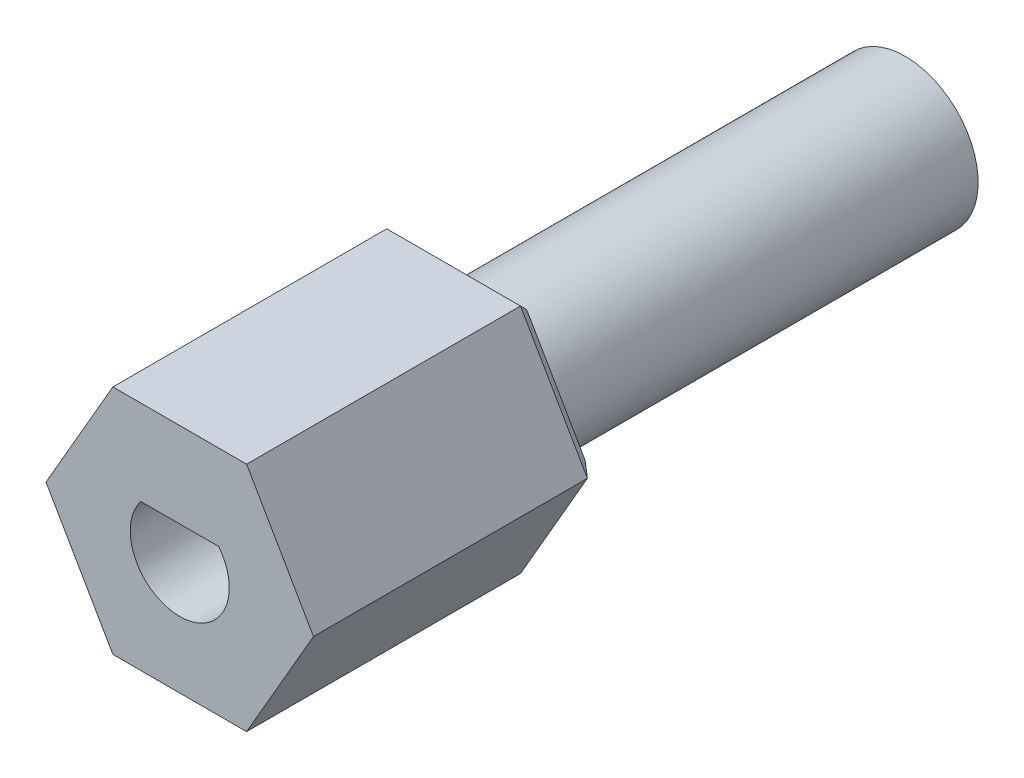
ISO-10303-21;
HEADER;
FILE_DESCRIPTION(('STEP AP214'),'2;1');
FILE_NAME('part.step','',(''),(''),'','','');
FILE_SCHEMA(('AUTOMOTIVE_DESIGN { 1 0 10303 214 1 1 1 1 }'));
ENDSEC;
DATA;
#1=APPLICATION_CONTEXT('core data for automotive mechanical design processes');
#2=APPLICATION_PROTOCOL_DEFINITION('international standard','automotive_design',2000,#1);
#3=PRODUCT_CONTEXT('',#1,'mechanical');
#4=PRODUCT('Part','Part','',(#3));
#5=PRODUCT_RELATED_PRODUCT_CATEGORY('part','',(#4));
#6=PRODUCT_DEFINITION_FORMATION('','',#4);
#7=PRODUCT_DEFINITION_CONTEXT('part definition',#1,'design');
#8=PRODUCT_DEFINITION('design','',#6,#7);
#9=PRODUCT_DEFINITION_SHAPE('','',#8);
#10=(LENGTH_UNIT() NAMED_UNIT(*) SI_UNIT(.MILLI.,.METRE.));
#11=(NAMED_UNIT(*) PLANE_ANGLE_UNIT() SI_UNIT($,.RADIAN.));
#12=(NAMED_UNIT(*) SI_UNIT($,.STERADIAN.) SOLID_ANGLE_UNIT());
#13=UNCERTAINTY_MEASURE_WITH_UNIT(LENGTH_MEASURE(1.E-05),#10,'distance_accuracy_value','');
#14=(GEOMETRIC_REPRESENTATION_CONTEXT(3) GLOBAL_UNCERTAINTY_ASSIGNED_CONTEXT((#13)) GLOBAL_UNIT_ASSIGNED_CONTEXT((#10,
#11,#12)) REPRESENTATION_CONTEXT('',''));
#15=CARTESIAN_POINT('',(0.,0.,0.));
#16=DIRECTION('',(0.,0.,1.));
#17=DIRECTION('',(1.,0.,0.));
#18=AXIS2_PLACEMENT_3D('',#15,#16,#17);
#19=CARTESIAN_POINT('',(2.29496732002876,-3.975,9.9));
#20=DIRECTION('',(-0.866025403784439,0.499999999999999,0.));
#21=DIRECTION('',(-0.499999999999999,-0.866025403784439,0.));
#22=AXIS2_PLACEMENT_3D('',#19,#20,#21);
#23=PLANE('',#22);
#24=DIRECTION('',(0.,0.,-1.));
#25=VECTOR('',#24,1.);
#26=CARTESIAN_POINT('',(2.29496732002876,-3.975,9.9));
#27=LINE('',#26,#25);
#28=CARTESIAN_POINT('',(2.29496732002876,-3.975,9.9));
#29=VERTEX_POINT('',#28);
#30=CARTESIAN_POINT('',(2.29496732002876,-3.975,0.500000000000007));
#31=VERTEX_POINT('',#30);
#32=EDGE_CURVE('E186',#29,#31,#27,.T.);
#33=ORIENTED_EDGE('',*,*,#32,.T.);
#34=DIRECTION('',(0.499999999999999,0.866025403784439,0.));
#35=VECTOR('',#34,1.);
#36=CARTESIAN_POINT('',(2.29496732002876,-3.975,0.500000000000004));
#37=LINE('',#36,#35);
#38=CARTESIAN_POINT('',(4.58993464005752,0.,0.500000000000007));
#39=VERTEX_POINT('',#38);
#40=EDGE_CURVE('E64',#31,#39,#37,.T.);
#41=ORIENTED_EDGE('',*,*,#40,.T.);
#42=DIRECTION('',(0.,0.,-1.));
#43=VECTOR('',#42,1.);
#44=CARTESIAN_POINT('',(4.58993464005752,0.,9.9));
#45=LINE('',#44,#43);
#46=CARTESIAN_POINT('',(4.58993464005752,0.,9.9));
#47=VERTEX_POINT('',#46);
#48=EDGE_CURVE('E204',#47,#39,#45,.T.);
#49=ORIENTED_EDGE('',*,*,#48,.F.);
#50=DIRECTION('',(0.499999999999999,0.866025403784439,0.));
#51=VECTOR('',#50,1.);
#52=CARTESIAN_POINT('',(2.29496732002876,-3.975,9.9));
#53=LINE('',#52,#51);
#54=EDGE_CURVE('E166',#29,#47,#53,.T.);
#55=ORIENTED_EDGE('',*,*,#54,.F.);
#56=EDGE_LOOP('',(#33,#41,#49,#55));
#57=FACE_BOUND('',#56,.T.);
#58=ADVANCED_FACE('F47',(#57),#23,.F.);
#59=CARTESIAN_POINT('',(4.58993464005752,0.,9.9));
#60=DIRECTION('',(-0.866025403784439,-0.5,0.));
#61=DIRECTION('',(0.5,-0.866025403784439,0.));
#62=AXIS2_PLACEMENT_3D('',#59,#60,#61);
#63=PLANE('',#62);
#64=ORIENTED_EDGE('',*,*,#48,.T.);
#65=DIRECTION('',(-0.5,0.866025403784439,0.));
#66=VECTOR('',#65,1.);
#67=CARTESIAN_POINT('',(4.58993464005752,0.,0.500000000000004));
#68=LINE('',#67,#66);
#69=CARTESIAN_POINT('',(2.29496732002876,3.975,0.500000000000007));
#70=VERTEX_POINT('',#69);
#71=EDGE_CURVE('E71',#39,#70,#68,.T.);
#72=ORIENTED_EDGE('',*,*,#71,.T.);
#73=DIRECTION('',(0.,0.,-1.));
#74=VECTOR('',#73,1.);
#75=CARTESIAN_POINT('',(2.29496732002876,3.975,9.9));
#76=LINE('',#75,#74);
#77=CARTESIAN_POINT('',(2.29496732002876,3.975,9.9));
#78=VERTEX_POINT('',#77);
#79=EDGE_CURVE('E201',#78,#70,#76,.T.);
#80=ORIENTED_EDGE('',*,*,#79,.F.);
#81=DIRECTION('',(-0.5,0.866025403784439,0.));
#82=VECTOR('',#81,1.);
#83=CARTESIAN_POINT('',(4.58993464005752,0.,9.9));
#84=LINE('',#83,#82);
#85=EDGE_CURVE('E171',#47,#78,#84,.T.);
#86=ORIENTED_EDGE('',*,*,#85,.F.);
#87=EDGE_LOOP('',(#64,#72,#80,#86));
#88=FACE_BOUND('',#87,.T.);
#89=ADVANCED_FACE('F285',(#88),#63,.F.);
#90=CARTESIAN_POINT('',(2.29496732002876,3.975,9.9));
#91=DIRECTION('',(0.,-1.,0.));
#92=DIRECTION('',(1.,0.,0.));
#93=AXIS2_PLACEMENT_3D('',#90,#91,#92);
#94=PLANE('',#93);
#95=ORIENTED_EDGE('',*,*,#79,.T.);
#96=DIRECTION('',(-1.,0.,0.));
#97=VECTOR('',#96,1.);
#98=CARTESIAN_POINT('',(2.29496732002876,3.975,0.500000000000004));
#99=LINE('',#98,#97);
#100=CARTESIAN_POINT('',(-2.29496732002876,3.975,0.500000000000007));
#101=VERTEX_POINT('',#100);
#102=EDGE_CURVE('E237',#70,#101,#99,.T.);
#103=ORIENTED_EDGE('',*,*,#102,.T.);
#104=DIRECTION('',(0.,0.,-1.));
#105=VECTOR('',#104,1.);
#106=CARTESIAN_POINT('',(-2.29496732002876,3.975,9.9));
#107=LINE('',#106,#105);
#108=CARTESIAN_POINT('',(-2.29496732002876,3.975,9.9));
#109=VERTEX_POINT('',#108);
#110=EDGE_CURVE('E197',#109,#101,#107,.T.);
#111=ORIENTED_EDGE('',*,*,#110,.F.);
#112=DIRECTION('',(-1.,0.,0.));
#113=VECTOR('',#112,1.);
#114=CARTESIAN_POINT('',(2.29496732002876,3.975,9.9));
#115=LINE('',#114,#113);
#116=EDGE_CURVE('E174',#78,#109,#115,.T.);
#117=ORIENTED_EDGE('',*,*,#116,.F.);
#118=EDGE_LOOP('',(#95,#103,#111,#117));
#119=FACE_BOUND('',#118,.T.);
#120=ADVANCED_FACE('F291',(#119),#94,.F.);
#121=CARTESIAN_POINT('',(-2.29496732002876,3.975,9.9));
#122=DIRECTION('',(0.866025403784439,-0.499999999999999,0.));
#123=DIRECTION('',(0.499999999999999,0.866025403784439,0.));
#124=AXIS2_PLACEMENT_3D('',#121,#122,#123);
#125=PLANE('',#124);
#126=ORIENTED_EDGE('',*,*,#110,.T.);
#127=DIRECTION('',(-0.499999999999999,-0.866025403784439,0.));
#128=VECTOR('',#127,1.);
#129=CARTESIAN_POINT('',(-2.29496732002876,3.975,0.500000000000004));
#130=LINE('',#129,#128);
#131=CARTESIAN_POINT('',(-4.58993464005752,0.,0.500000000000007));
#132=VERTEX_POINT('',#131);
#133=EDGE_CURVE('E234',#101,#132,#130,.T.);
#134=ORIENTED_EDGE('',*,*,#133,.T.);
#135=DIRECTION('',(0.,0.,-1.));
#136=VECTOR('',#135,1.);
#137=CARTESIAN_POINT('',(-4.58993464005752,0.,9.9));
#138=LINE('',#137,#136);
#139=CARTESIAN_POINT('',(-4.58993464005752,0.,9.9));
#140=VERTEX_POINT('',#139);
#141=EDGE_CURVE('E193',#140,#132,#138,.T.);
#142=ORIENTED_EDGE('',*,*,#141,.F.);
#143=DIRECTION('',(-0.5,-0.866025403784439,0.));
#144=VECTOR('',#143,1.);
#145=CARTESIAN_POINT('',(-2.29496732002876,3.975,9.9));
#146=LINE('',#145,#144);
#147=EDGE_CURVE('E177',#109,#140,#146,.T.);
#148=ORIENTED_EDGE('',*,*,#147,.F.);
#149=EDGE_LOOP('',(#126,#134,#142,#148));
#150=FACE_BOUND('',#149,.T.);
#151=ADVANCED_FACE('F370',(#150),#125,.F.);
#152=CARTESIAN_POINT('',(-4.58993464005752,0.,9.9));
#153=DIRECTION('',(0.866025403784439,0.5,0.));
#154=DIRECTION('',(-0.5,0.866025403784439,0.));
#155=AXIS2_PLACEMENT_3D('',#152,#153,#154);
#156=PLANE('',#155);
#157=ORIENTED_EDGE('',*,*,#141,.T.);
#158=DIRECTION('',(0.5,-0.866025403784439,0.));
#159=VECTOR('',#158,1.);
#160=CARTESIAN_POINT('',(-4.58993464005752,0.,0.500000000000004));
#161=LINE('',#160,#159);
#162=CARTESIAN_POINT('',(-2.29496732002876,-3.975,0.500000000000007));
#163=VERTEX_POINT('',#162);
#164=EDGE_CURVE('E231',#132,#163,#161,.T.);
#165=ORIENTED_EDGE('',*,*,#164,.T.);
#166=DIRECTION('',(0.,0.,-1.));
#167=VECTOR('',#166,1.);
#168=CARTESIAN_POINT('',(-2.29496732002876,-3.975,9.9));
#169=LINE('',#168,#167);
#170=CARTESIAN_POINT('',(-2.29496732002876,-3.975,9.9));
#171=VERTEX_POINT('',#170);
#172=EDGE_CURVE('E189',#171,#163,#169,.T.);
#173=ORIENTED_EDGE('',*,*,#172,.F.);
#174=DIRECTION('',(0.5,-0.866025403784439,0.));
#175=VECTOR('',#174,1.);
#176=CARTESIAN_POINT('',(-4.58993464005752,0.,9.9));
#177=LINE('',#176,#175);
#178=EDGE_CURVE('E180',#140,#171,#177,.T.);
#179=ORIENTED_EDGE('',*,*,#178,.F.);
#180=EDGE_LOOP('',(#157,#165,#173,#179));
#181=FACE_BOUND('',#180,.T.);
#182=ADVANCED_FACE('F356',(#181),#156,.F.);
#183=CARTESIAN_POINT('',(-2.29496732002876,-3.975,9.9));
#184=DIRECTION('',(0.,1.,0.));
#185=DIRECTION('',(-1.,0.,0.));
#186=AXIS2_PLACEMENT_3D('',#183,#184,#185);
#187=PLANE('',#186);
#188=ORIENTED_EDGE('',*,*,#172,.T.);
#189=DIRECTION('',(1.,0.,0.));
#190=VECTOR('',#189,1.);
#191=CARTESIAN_POINT('',(-2.29496732002876,-3.975,0.500000000000004));
#192=LINE('',#191,#190);
#193=EDGE_CURVE('E208',#163,#31,#192,.T.);
#194=ORIENTED_EDGE('',*,*,#193,.T.);
#195=ORIENTED_EDGE('',*,*,#32,.F.);
#196=DIRECTION('',(1.,0.,0.));
#197=VECTOR('',#196,1.);
#198=CARTESIAN_POINT('',(-2.29496732002876,-3.975,9.9));
#199=LINE('',#198,#197);
#200=EDGE_CURVE('E183',#171,#29,#199,.T.);
#201=ORIENTED_EDGE('',*,*,#200,.F.);
#202=EDGE_LOOP('',(#188,#194,#195,#201));
#203=FACE_BOUND('',#202,.T.);
#204=ADVANCED_FACE('F361',(#203),#187,.F.);
#205=CARTESIAN_POINT('',(0.,0.,9.9));
#206=DIRECTION('',(0.,0.,1.));
#207=DIRECTION('',(1.,0.,0.));
#208=AXIS2_PLACEMENT_3D('',#205,#206,#207);
#209=PLANE('',#208);
#210=CARTESIAN_POINT('',(0.,0.,9.9));
#211=DIRECTION('',(0.,0.,1.));
#212=DIRECTION('',(1.,0.,0.));
#213=AXIS2_PLACEMENT_3D('',#210,#211,#212);
#214=CIRCLE('',#213,1.7);
#215=CARTESIAN_POINT('',(-1.33697419571209,1.05,9.9));
#216=VERTEX_POINT('',#215);
#217=CARTESIAN_POINT('',(1.33697419571209,1.05,9.9));
#218=VERTEX_POINT('',#217);
#219=EDGE_CURVE('E141',#216,#218,#214,.T.);
#220=ORIENTED_EDGE('',*,*,#219,.F.);
#221=DIRECTION('',(-1.,0.,0.));
#222=VECTOR('',#221,1.);
#223=CARTESIAN_POINT('',(-1.33697419571209,1.05,9.9));
#224=LINE('',#223,#222);
#225=EDGE_CURVE('E153',#218,#216,#224,.T.);
#226=ORIENTED_EDGE('',*,*,#225,.F.);
#227=EDGE_LOOP('',(#220,#226));
#228=FACE_BOUND('',#227,.T.);
#229=ORIENTED_EDGE('',*,*,#54,.T.);
#230=ORIENTED_EDGE('',*,*,#85,.T.);
#231=ORIENTED_EDGE('',*,*,#116,.T.);
#232=ORIENTED_EDGE('',*,*,#147,.T.);
#233=ORIENTED_EDGE('',*,*,#178,.T.);
#234=ORIENTED_EDGE('',*,*,#200,.T.);
#235=EDGE_LOOP('',(#229,#230,#231,#232,#233,#234));
#236=FACE_BOUND('',#235,.T.);
#237=ADVANCED_FACE('F365',(#228,#236),#209,.T.);
#238=CARTESIAN_POINT('',(0.,0.,0.));
#239=DIRECTION('',(0.,0.,1.));
#240=DIRECTION('',(1.,0.,0.));
#241=AXIS2_PLACEMENT_3D('',#238,#239,#240);
#242=PLANE('',#241);
#243=DIRECTION('',(-0.499999999999999,-0.866025403784439,0.));
#244=VECTOR('',#243,1.);
#245=CARTESIAN_POINT('',(3.00943827815092,-1.73749999999999,0.));
#246=LINE('',#245,#244);
#247=CARTESIAN_POINT('',(4.01258437086789,0.,0.));
#248=VERTEX_POINT('',#247);
#249=CARTESIAN_POINT('',(2.00629218543395,-3.47499999999999,0.));
#250=VERTEX_POINT('',#249);
#251=EDGE_CURVE('E212',#248,#250,#246,.T.);
#252=ORIENTED_EDGE('',*,*,#251,.T.);
#253=DIRECTION('',(-1.,0.,0.));
#254=VECTOR('',#253,1.);
#255=CARTESIAN_POINT('',(0.,-3.475,0.));
#256=LINE('',#255,#254);
#257=CARTESIAN_POINT('',(-2.00629218543395,-3.475,0.));
#258=VERTEX_POINT('',#257);
#259=EDGE_CURVE('E227',#250,#258,#256,.T.);
#260=ORIENTED_EDGE('',*,*,#259,.T.);
#261=DIRECTION('',(-0.5,0.866025403784439,0.));
#262=VECTOR('',#261,1.);
#263=CARTESIAN_POINT('',(-3.00943827815092,-1.7375,0.));
#264=LINE('',#263,#262);
#265=CARTESIAN_POINT('',(-4.01258437086789,0.,0.));
#266=VERTEX_POINT('',#265);
#267=EDGE_CURVE('E224',#258,#266,#264,.T.);
#268=ORIENTED_EDGE('',*,*,#267,.T.);
#269=DIRECTION('',(0.499999999999999,0.866025403784439,0.));
#270=VECTOR('',#269,1.);
#271=CARTESIAN_POINT('',(-3.00943827815092,1.73749999999999,0.));
#272=LINE('',#271,#270);
#273=CARTESIAN_POINT('',(-2.00629218543395,3.47499999999999,0.));
#274=VERTEX_POINT('',#273);
#275=EDGE_CURVE('E221',#266,#274,#272,.T.);
#276=ORIENTED_EDGE('',*,*,#275,.T.);
#277=DIRECTION('',(1.,0.,0.));
#278=VECTOR('',#277,1.);
#279=CARTESIAN_POINT('',(0.,3.47499999999999,0.));
#280=LINE('',#279,#278);
#281=CARTESIAN_POINT('',(2.00629218543395,3.47499999999999,0.));
#282=VERTEX_POINT('',#281);
#283=EDGE_CURVE('E218',#274,#282,#280,.T.);
#284=ORIENTED_EDGE('',*,*,#283,.T.);
#285=DIRECTION('',(0.5,-0.866025403784439,0.));
#286=VECTOR('',#285,1.);
#287=CARTESIAN_POINT('',(3.00943827815092,1.7375,0.));
#288=LINE('',#287,#286);
#289=EDGE_CURVE('E215',#282,#248,#288,.T.);
#290=ORIENTED_EDGE('',*,*,#289,.T.);
#291=EDGE_LOOP('',(#252,#260,#268,#276,#284,#290));
#292=FACE_BOUND('',#291,.T.);
#293=CARTESIAN_POINT('',(0.,0.,0.));
#294=DIRECTION('',(0.,0.,-1.));
#295=DIRECTION('',(-1.,0.,0.));
#296=AXIS2_PLACEMENT_3D('',#293,#294,#295);
#297=CIRCLE('',#296,2.5);
#298=CARTESIAN_POINT('',(-2.5,0.,0.));
#299=VERTEX_POINT('',#298);
#300=EDGE_CURVE('E207',#299,#299,#297,.T.);
#301=ORIENTED_EDGE('',*,*,#300,.F.);
#302=EDGE_LOOP('',(#301));
#303=FACE_BOUND('',#302,.T.);
#304=ADVANCED_FACE('F344',(#292,#303),#242,.F.);
#305=CARTESIAN_POINT('',(0.,0.,1.9));
#306=DIRECTION('',(0.,0.,1.));
#307=DIRECTION('',(1.,0.,0.));
#308=AXIS2_PLACEMENT_3D('',#305,#306,#307);
#309=CYLINDRICAL_SURFACE('',#308,1.7);
#310=ORIENTED_EDGE('',*,*,#219,.T.);
#311=DIRECTION('',(0.,0.,1.));
#312=VECTOR('',#311,1.);
#313=CARTESIAN_POINT('',(1.33697419571209,1.05,1.9));
#314=LINE('',#313,#312);
#315=CARTESIAN_POINT('',(1.33697419571209,1.05,1.9));
#316=VERTEX_POINT('',#315);
#317=EDGE_CURVE('E135',#316,#218,#314,.T.);
#318=ORIENTED_EDGE('',*,*,#317,.F.);
#319=CARTESIAN_POINT('',(0.,0.,1.9));
#320=DIRECTION('',(0.,0.,1.));
#321=DIRECTION('',(1.,0.,0.));
#322=AXIS2_PLACEMENT_3D('',#319,#320,#321);
#323=CIRCLE('',#322,1.7);
#324=CARTESIAN_POINT('',(-1.33697419571209,1.05,1.9));
#325=VERTEX_POINT('',#324);
#326=EDGE_CURVE('E138',#325,#316,#323,.T.);
#327=ORIENTED_EDGE('',*,*,#326,.F.);
#328=DIRECTION('',(0.,0.,1.));
#329=VECTOR('',#328,1.);
#330=CARTESIAN_POINT('',(-1.33697419571209,1.05,1.9));
#331=LINE('',#330,#329);
#332=EDGE_CURVE('E147',#325,#216,#331,.T.);
#333=ORIENTED_EDGE('',*,*,#332,.T.);
#334=EDGE_LOOP('',(#310,#318,#327,#333));
#335=FACE_BOUND('',#334,.T.);
#336=ADVANCED_FACE('F137',(#335),#309,.F.);
#337=CARTESIAN_POINT('',(-1.33697419571209,1.05,1.9));
#338=DIRECTION('',(0.,1.,0.));
#339=DIRECTION('',(-1.,0.,0.));
#340=AXIS2_PLACEMENT_3D('',#337,#338,#339);
#341=PLANE('',#340);
#342=ORIENTED_EDGE('',*,*,#225,.T.);
#343=ORIENTED_EDGE('',*,*,#332,.F.);
#344=DIRECTION('',(-1.,0.,0.));
#345=VECTOR('',#344,1.);
#346=CARTESIAN_POINT('',(-1.33697419571209,1.05,1.9));
#347=LINE('',#346,#345);
#348=EDGE_CURVE('E148',#316,#325,#347,.T.);
#349=ORIENTED_EDGE('',*,*,#348,.F.);
#350=ORIENTED_EDGE('',*,*,#317,.T.);
#351=EDGE_LOOP('',(#342,#343,#349,#350));
#352=FACE_BOUND('',#351,.T.);
#353=ADVANCED_FACE('F155',(#352),#341,.F.);
#354=CARTESIAN_POINT('',(0.,0.,1.9));
#355=DIRECTION('',(0.,0.,1.));
#356=DIRECTION('',(1.,0.,0.));
#357=AXIS2_PLACEMENT_3D('',#354,#355,#356);
#358=PLANE('',#357);
#359=ORIENTED_EDGE('',*,*,#326,.T.);
#360=ORIENTED_EDGE('',*,*,#348,.T.);
#361=EDGE_LOOP('',(#359,#360));
#362=FACE_BOUND('',#361,.T.);
#363=ADVANCED_FACE('F151',(#362),#358,.T.);
#364=CARTESIAN_POINT('',(0.,0.,-15.));
#365=DIRECTION('',(0.,0.,1.));
#366=DIRECTION('',(1.,0.,0.));
#367=AXIS2_PLACEMENT_3D('',#364,#365,#366);
#368=CYLINDRICAL_SURFACE('',#367,2.5);
#369=CARTESIAN_POINT('',(0.,0.,-15.));
#370=DIRECTION('',(0.,0.,-1.));
#371=DIRECTION('',(-1.,0.,0.));
#372=AXIS2_PLACEMENT_3D('',#369,#370,#371);
#373=CIRCLE('',#372,2.5);
#374=CARTESIAN_POINT('',(-2.5,0.,-15.));
#375=VERTEX_POINT('',#374);
#376=EDGE_CURVE('E162',#375,#375,#373,.T.);
#377=ORIENTED_EDGE('',*,*,#376,.F.);
#378=EDGE_LOOP('',(#377));
#379=FACE_BOUND('',#378,.T.);
#380=ORIENTED_EDGE('',*,*,#300,.T.);
#381=EDGE_LOOP('',(#380));
#382=FACE_BOUND('',#381,.T.);
#383=ADVANCED_FACE('F393',(#379,#382),#368,.T.);
#384=CARTESIAN_POINT('',(0.,0.,-15.));
#385=DIRECTION('',(0.,0.,-1.));
#386=DIRECTION('',(-1.,0.,0.));
#387=AXIS2_PLACEMENT_3D('',#384,#385,#386);
#388=PLANE('',#387);
#389=CARTESIAN_POINT('',(0.,0.,-15.));
#390=DIRECTION('',(0.,0.,-1.));
#391=DIRECTION('',(-1.,0.,0.));
#392=AXIS2_PLACEMENT_3D('',#389,#390,#391);
#393=CIRCLE('',#392,1.95);
#394=CARTESIAN_POINT('',(-1.95,0.,-15.));
#395=VERTEX_POINT('',#394);
#396=EDGE_CURVE('E11',#395,#395,#393,.F.);
#397=ORIENTED_EDGE('',*,*,#396,.T.);
#398=EDGE_LOOP('',(#397));
#399=FACE_BOUND('',#398,.T.);
#400=ORIENTED_EDGE('',*,*,#376,.T.);
#401=EDGE_LOOP('',(#400));
#402=FACE_BOUND('',#401,.T.);
#403=ADVANCED_FACE('F396',(#399,#402),#388,.T.);
#404=CARTESIAN_POINT('',(0.,0.,-0.999999999999999));
#405=DIRECTION('',(0.,0.,-1.));
#406=DIRECTION('',(-1.,0.,0.));
#407=AXIS2_PLACEMENT_3D('',#404,#405,#406);
#408=CYLINDRICAL_SURFACE('',#407,1.45);
#409=CARTESIAN_POINT('',(0.,0.,-14.5));
#410=DIRECTION('',(0.,0.,-1.));
#411=DIRECTION('',(-1.,0.,0.));
#412=AXIS2_PLACEMENT_3D('',#409,#410,#411);
#413=CIRCLE('',#412,1.45);
#414=CARTESIAN_POINT('',(-1.45,0.,-14.5));
#415=VERTEX_POINT('',#414);
#416=EDGE_CURVE('E57',#415,#415,#413,.T.);
#417=ORIENTED_EDGE('',*,*,#416,.T.);
#418=EDGE_LOOP('',(#417));
#419=FACE_BOUND('',#418,.T.);
#420=CARTESIAN_POINT('',(0.,0.,-0.999999999999999));
#421=DIRECTION('',(0.,0.,-1.));
#422=DIRECTION('',(-1.,0.,0.));
#423=AXIS2_PLACEMENT_3D('',#420,#421,#422);
#424=CIRCLE('',#423,1.45);
#425=CARTESIAN_POINT('',(-1.45,0.,-0.999999999999999));
#426=VERTEX_POINT('',#425);
#427=EDGE_CURVE('E265',#426,#426,#424,.T.);
#428=ORIENTED_EDGE('',*,*,#427,.F.);
#429=EDGE_LOOP('',(#428));
#430=FACE_BOUND('',#429,.T.);
#431=ADVANCED_FACE('F270',(#419,#430),#408,.F.);
#432=CARTESIAN_POINT('',(0.,0.,-0.999999999999999));
#433=DIRECTION('',(0.,0.,-1.));
#434=DIRECTION('',(-1.,0.,0.));
#435=AXIS2_PLACEMENT_3D('',#432,#433,#434);
#436=PLANE('',#435);
#437=ORIENTED_EDGE('',*,*,#427,.T.);
#438=EDGE_LOOP('',(#437));
#439=FACE_BOUND('',#438,.T.);
#440=ADVANCED_FACE('F329',(#439),#436,.T.);
#441=CARTESIAN_POINT('',(2.29496732002876,3.975,0.500000000000004));
#442=DIRECTION('',(0.,-0.707106781186546,0.707106781186549));
#443=DIRECTION('',(-1.,0.,0.));
#444=AXIS2_PLACEMENT_3D('',#441,#442,#443);
#445=PLANE('',#444);
#446=DIRECTION('',(0.377964473009227,0.654653670707978,0.654653670707976));
#447=VECTOR('',#446,1.);
#448=CARTESIAN_POINT('',(1.63926237144911,2.83928571428571,-0.635714285714283));
#449=LINE('',#448,#447);
#450=EDGE_CURVE('E258',#282,#70,#449,.T.);
#451=ORIENTED_EDGE('',*,*,#450,.F.);
#452=ORIENTED_EDGE('',*,*,#283,.F.);
#453=DIRECTION('',(-0.377964473009228,0.654653670707978,0.654653670707976));
#454=VECTOR('',#453,1.);
#455=CARTESIAN_POINT('',(-1.63926237144911,2.83928571428571,-0.635714285714282));
#456=LINE('',#455,#454);
#457=EDGE_CURVE('E262',#101,#274,#456,.F.);
#458=ORIENTED_EDGE('',*,*,#457,.F.);
#459=ORIENTED_EDGE('',*,*,#102,.F.);
#460=EDGE_LOOP('',(#451,#452,#458,#459));
#461=FACE_BOUND('',#460,.T.);
#462=ADVANCED_FACE('F324',(#461),#445,.F.);
#463=CARTESIAN_POINT('',(-2.29496732002876,3.975,0.500000000000004));
#464=DIRECTION('',(0.612372435695794,-0.353553390593273,0.707106781186549));
#465=DIRECTION('',(-0.499999999999999,-0.866025403784439,0.));
#466=AXIS2_PLACEMENT_3D('',#463,#464,#465);
#467=PLANE('',#466);
#468=ORIENTED_EDGE('',*,*,#457,.T.);
#469=ORIENTED_EDGE('',*,*,#275,.F.);
#470=DIRECTION('',(-0.755928946018455,0.,0.654653670707976));
#471=VECTOR('',#470,1.);
#472=CARTESIAN_POINT('',(-3.27852474289823,0.,-0.635714285714277));
#473=LINE('',#472,#471);
#474=EDGE_CURVE('E254',#132,#266,#473,.F.);
#475=ORIENTED_EDGE('',*,*,#474,.F.);
#476=ORIENTED_EDGE('',*,*,#133,.F.);
#477=EDGE_LOOP('',(#468,#469,#475,#476));
#478=FACE_BOUND('',#477,.T.);
#479=ADVANCED_FACE('F318',(#478),#467,.F.);
#480=CARTESIAN_POINT('',(4.58993464005752,0.,0.500000000000004));
#481=DIRECTION('',(-0.612372435695794,-0.353553390593273,0.707106781186548));
#482=DIRECTION('',(-0.5,0.866025403784439,0.));
#483=AXIS2_PLACEMENT_3D('',#480,#481,#482);
#484=PLANE('',#483);
#485=ORIENTED_EDGE('',*,*,#450,.T.);
#486=ORIENTED_EDGE('',*,*,#71,.F.);
#487=DIRECTION('',(0.755928946018455,0.,0.654653670707976));
#488=VECTOR('',#487,1.);
#489=CARTESIAN_POINT('',(3.27852474289823,0.,-0.63571428571428));
#490=LINE('',#489,#488);
#491=EDGE_CURVE('E250',#248,#39,#490,.T.);
#492=ORIENTED_EDGE('',*,*,#491,.F.);
#493=ORIENTED_EDGE('',*,*,#289,.F.);
#494=EDGE_LOOP('',(#485,#486,#492,#493));
#495=FACE_BOUND('',#494,.T.);
#496=ADVANCED_FACE('F311',(#495),#484,.F.);
#497=CARTESIAN_POINT('',(-4.58993464005752,0.,0.500000000000004));
#498=DIRECTION('',(0.612372435695794,0.353553390593274,0.707106781186548));
#499=DIRECTION('',(0.5,-0.866025403784439,0.));
#500=AXIS2_PLACEMENT_3D('',#497,#498,#499);
#501=PLANE('',#500);
#502=ORIENTED_EDGE('',*,*,#474,.T.);
#503=ORIENTED_EDGE('',*,*,#267,.F.);
#504=DIRECTION('',(-0.377964473009226,-0.654653670707979,0.654653670707976));
#505=VECTOR('',#504,1.);
#506=CARTESIAN_POINT('',(-1.63926237144911,-2.83928571428571,-0.635714285714285));
#507=LINE('',#506,#505);
#508=EDGE_CURVE('E247',#163,#258,#507,.F.);
#509=ORIENTED_EDGE('',*,*,#508,.F.);
#510=ORIENTED_EDGE('',*,*,#164,.F.);
#511=EDGE_LOOP('',(#502,#503,#509,#510));
#512=FACE_BOUND('',#511,.T.);
#513=ADVANCED_FACE('F304',(#512),#501,.F.);
#514=CARTESIAN_POINT('',(2.29496732002876,-3.975,0.500000000000004));
#515=DIRECTION('',(-0.612372435695794,0.353553390593273,0.707106781186549));
#516=DIRECTION('',(0.499999999999999,0.866025403784439,0.));
#517=AXIS2_PLACEMENT_3D('',#514,#515,#516);
#518=PLANE('',#517);
#519=ORIENTED_EDGE('',*,*,#491,.T.);
#520=ORIENTED_EDGE('',*,*,#40,.F.);
#521=DIRECTION('',(-0.377964473009228,0.654653670707978,-0.654653670707976));
#522=VECTOR('',#521,1.);
#523=CARTESIAN_POINT('',(2.29496732002876,-3.975,0.500000000000004));
#524=LINE('',#523,#522);
#525=EDGE_CURVE('E244',#250,#31,#524,.F.);
#526=ORIENTED_EDGE('',*,*,#525,.F.);
#527=ORIENTED_EDGE('',*,*,#251,.F.);
#528=EDGE_LOOP('',(#519,#520,#526,#527));
#529=FACE_BOUND('',#528,.T.);
#530=ADVANCED_FACE('F280',(#529),#518,.F.);
#531=CARTESIAN_POINT('',(-2.29496732002876,-3.975,0.500000000000004));
#532=DIRECTION('',(0.,0.707106781186546,0.707106781186549));
#533=DIRECTION('',(1.,0.,0.));
#534=AXIS2_PLACEMENT_3D('',#531,#532,#533);
#535=PLANE('',#534);
#536=ORIENTED_EDGE('',*,*,#508,.T.);
#537=ORIENTED_EDGE('',*,*,#259,.F.);
#538=ORIENTED_EDGE('',*,*,#525,.T.);
#539=ORIENTED_EDGE('',*,*,#193,.F.);
#540=EDGE_LOOP('',(#536,#537,#538,#539));
#541=FACE_BOUND('',#540,.T.);
#542=ADVANCED_FACE('F274',(#541),#535,.F.);
#543=CARTESIAN_POINT('',(0.,0.,-14.5));
#544=DIRECTION('',(0.,0.,-1.));
#545=DIRECTION('',(-1.,0.,0.));
#546=AXIS2_PLACEMENT_3D('',#543,#544,#545);
#547=CONICAL_SURFACE('',#546,1.45,0.78539816339745);
#548=ORIENTED_EDGE('',*,*,#396,.F.);
#549=EDGE_LOOP('',(#548));
#550=FACE_BOUND('',#549,.T.);
#551=ORIENTED_EDGE('',*,*,#416,.F.);
#552=EDGE_LOOP('',(#551));
#553=FACE_BOUND('',#552,.T.);
#554=ADVANCED_FACE('F50',(#550,#553),#547,.F.);
#555=CLOSED_SHELL('',(#58,#89,#120,#151,#182,#204,#237,#304,#336,#353,#363,#383,#403,#431,#440,
#462,#479,#496,#513,#530,#542,#554));
#556=MANIFOLD_SOLID_BREP('B2',#555);
#557=ADVANCED_BREP_SHAPE_REPRESENTATION('',(#18,#556),#14);
#558=SHAPE_DEFINITION_REPRESENTATION(#9,#557);
ENDSEC;
END-ISO-10303-21;
